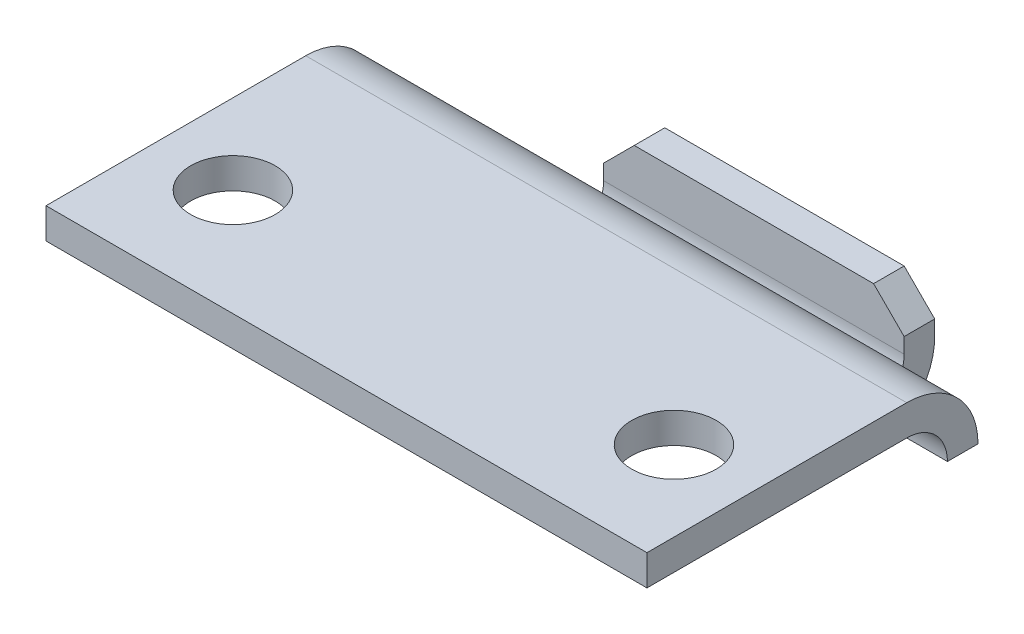
ISO-10303-21;
HEADER;
FILE_DESCRIPTION(('STEP AP214'),'2;1');
FILE_NAME('part.step','',(''),(''),'','','');
FILE_SCHEMA(('AUTOMOTIVE_DESIGN { 1 0 10303 214 1 1 1 1 }'));
ENDSEC;
DATA;
#1=APPLICATION_CONTEXT('core data for automotive mechanical design processes');
#2=APPLICATION_PROTOCOL_DEFINITION('international standard','automotive_design',2000,#1);
#3=PRODUCT_CONTEXT('',#1,'mechanical');
#4=PRODUCT('Part','Part','',(#3));
#5=PRODUCT_RELATED_PRODUCT_CATEGORY('part','',(#4));
#6=PRODUCT_DEFINITION_FORMATION('','',#4);
#7=PRODUCT_DEFINITION_CONTEXT('part definition',#1,'design');
#8=PRODUCT_DEFINITION('design','',#6,#7);
#9=PRODUCT_DEFINITION_SHAPE('','',#8);
#10=(LENGTH_UNIT() NAMED_UNIT(*) SI_UNIT(.MILLI.,.METRE.));
#11=(NAMED_UNIT(*) PLANE_ANGLE_UNIT() SI_UNIT($,.RADIAN.));
#12=(NAMED_UNIT(*) SI_UNIT($,.STERADIAN.) SOLID_ANGLE_UNIT());
#13=UNCERTAINTY_MEASURE_WITH_UNIT(LENGTH_MEASURE(1.E-05),#10,'distance_accuracy_value','');
#14=(GEOMETRIC_REPRESENTATION_CONTEXT(3) GLOBAL_UNCERTAINTY_ASSIGNED_CONTEXT((#13)) GLOBAL_UNIT_ASSIGNED_CONTEXT((#10,
#11,#12)) REPRESENTATION_CONTEXT('',''));
#15=CARTESIAN_POINT('',(0.,0.,0.));
#16=DIRECTION('',(0.,0.,1.));
#17=DIRECTION('',(1.,0.,0.));
#18=AXIS2_PLACEMENT_3D('',#15,#16,#17);
#19=CARTESIAN_POINT('',(14.9860000000004,0.,5.33400000000031));
#20=DIRECTION('',(0.,1.,0.));
#21=DIRECTION('',(0.,0.,1.00000000000001));
#22=AXIS2_PLACEMENT_3D('',#19,#20,#21);
#23=PLANE('',#22);
#24=CARTESIAN_POINT('',(10.9982000000004,0.,0.));
#25=DIRECTION('',(0.,1.,0.));
#26=DIRECTION('',(0.,0.,1.00000000000001));
#27=AXIS2_PLACEMENT_3D('',#24,#25,#26);
#28=CIRCLE('',#27,2.1082);
#29=CARTESIAN_POINT('',(10.9982000000004,0.,2.10819999999993));
#30=VERTEX_POINT('',#29);
#31=EDGE_CURVE('E302',#30,#30,#28,.T.);
#32=ORIENTED_EDGE('',*,*,#31,.T.);
#33=EDGE_LOOP('',(#32));
#34=FACE_BOUND('',#33,.T.);
#35=DIRECTION('',(0.,0.,-1.00000000000001));
#36=VECTOR('',#35,1.);
#37=CARTESIAN_POINT('',(-14.9860000000002,0.,5.33400000000039));
#38=LINE('',#37,#36);
#39=CARTESIAN_POINT('',(-14.9860000000002,0.,5.33400000000039));
#40=VERTEX_POINT('',#39);
#41=CARTESIAN_POINT('',(-14.9860000000002,0.,-7.61999999999996));
#42=VERTEX_POINT('',#41);
#43=EDGE_CURVE('E244',#40,#42,#38,.T.);
#44=ORIENTED_EDGE('',*,*,#43,.T.);
#45=DIRECTION('',(-1.00000000000001,0.,0.));
#46=VECTOR('',#45,1.);
#47=CARTESIAN_POINT('',(14.9860000000004,0.,-7.62000000000004));
#48=LINE('',#47,#46);
#49=CARTESIAN_POINT('',(14.9860000000004,0.,-7.62000000000004));
#50=VERTEX_POINT('',#49);
#51=EDGE_CURVE('E188',#50,#42,#48,.T.);
#52=ORIENTED_EDGE('',*,*,#51,.F.);
#53=DIRECTION('',(0.,0.,-1.00000000000001));
#54=VECTOR('',#53,1.);
#55=CARTESIAN_POINT('',(14.9860000000004,0.,5.33400000000031));
#56=LINE('',#55,#54);
#57=CARTESIAN_POINT('',(14.9860000000004,0.,5.33400000000031));
#58=VERTEX_POINT('',#57);
#59=EDGE_CURVE('E256',#58,#50,#56,.T.);
#60=ORIENTED_EDGE('',*,*,#59,.F.);
#61=DIRECTION('',(-1.00000000000001,0.,0.));
#62=VECTOR('',#61,1.);
#63=CARTESIAN_POINT('',(14.9860000000004,0.,5.33400000000031));
#64=LINE('',#63,#62);
#65=EDGE_CURVE('E191',#58,#40,#64,.T.);
#66=ORIENTED_EDGE('',*,*,#65,.T.);
#67=EDGE_LOOP('',(#44,#52,#60,#66));
#68=FACE_BOUND('',#67,.T.);
#69=CARTESIAN_POINT('',(-10.9982,0.,0.));
#70=DIRECTION('',(0.,1.,0.));
#71=DIRECTION('',(0.,0.,-1.00000000000001));
#72=AXIS2_PLACEMENT_3D('',#69,#70,#71);
#73=CIRCLE('',#72,2.1082);
#74=CARTESIAN_POINT('',(-10.9982,0.,-2.10820000000001));
#75=VERTEX_POINT('',#74);
#76=EDGE_CURVE('E308',#75,#75,#73,.T.);
#77=ORIENTED_EDGE('',*,*,#76,.T.);
#78=EDGE_LOOP('',(#77));
#79=FACE_BOUND('',#78,.T.);
#80=ADVANCED_FACE('F38',(#34,#68,#79),#23,.F.);
#81=CARTESIAN_POINT('',(14.9860000000004,1.524,5.33400000000031));
#82=DIRECTION('',(0.,-1.,0.));
#83=DIRECTION('',(0.,0.,-1.00000000000001));
#84=AXIS2_PLACEMENT_3D('',#81,#82,#83);
#85=PLANE('',#84);
#86=CARTESIAN_POINT('',(10.9982000000004,1.524,0.));
#87=DIRECTION('',(0.,1.,0.));
#88=DIRECTION('',(0.,0.,1.00000000000001));
#89=AXIS2_PLACEMENT_3D('',#86,#87,#88);
#90=CIRCLE('',#89,2.1082);
#91=CARTESIAN_POINT('',(10.9982000000004,1.524,2.10819999999993));
#92=VERTEX_POINT('',#91);
#93=EDGE_CURVE('E171',#92,#92,#90,.T.);
#94=ORIENTED_EDGE('',*,*,#93,.F.);
#95=EDGE_LOOP('',(#94));
#96=FACE_BOUND('',#95,.T.);
#97=DIRECTION('',(0.,0.,1.00000000000001));
#98=VECTOR('',#97,1.);
#99=CARTESIAN_POINT('',(-14.9860000000002,1.524,5.33400000000039));
#100=LINE('',#99,#98);
#101=CARTESIAN_POINT('',(-14.9860000000002,1.524,-7.61999999999996));
#102=VERTEX_POINT('',#101);
#103=CARTESIAN_POINT('',(-14.9860000000002,1.524,5.33400000000039));
#104=VERTEX_POINT('',#103);
#105=EDGE_CURVE('E251',#102,#104,#100,.T.);
#106=ORIENTED_EDGE('',*,*,#105,.T.);
#107=DIRECTION('',(-1.00000000000001,0.,0.));
#108=VECTOR('',#107,1.);
#109=CARTESIAN_POINT('',(14.9860000000004,1.524,5.33400000000031));
#110=LINE('',#109,#108);
#111=CARTESIAN_POINT('',(14.9860000000004,1.524,5.33400000000031));
#112=VERTEX_POINT('',#111);
#113=EDGE_CURVE('E265',#112,#104,#110,.T.);
#114=ORIENTED_EDGE('',*,*,#113,.F.);
#115=DIRECTION('',(0.,0.,1.00000000000001));
#116=VECTOR('',#115,1.);
#117=CARTESIAN_POINT('',(14.9860000000004,1.524,5.33400000000031));
#118=LINE('',#117,#116);
#119=CARTESIAN_POINT('',(14.9860000000004,1.524,-7.62000000000004));
#120=VERTEX_POINT('',#119);
#121=EDGE_CURVE('E263',#120,#112,#118,.T.);
#122=ORIENTED_EDGE('',*,*,#121,.F.);
#123=DIRECTION('',(-1.00000000000001,0.,0.));
#124=VECTOR('',#123,1.);
#125=CARTESIAN_POINT('',(14.9860000000004,1.524,-7.62000000000004));
#126=LINE('',#125,#124);
#127=EDGE_CURVE('E268',#120,#102,#126,.T.);
#128=ORIENTED_EDGE('',*,*,#127,.T.);
#129=EDGE_LOOP('',(#106,#114,#122,#128));
#130=FACE_BOUND('',#129,.T.);
#131=CARTESIAN_POINT('',(-10.9982,1.524,0.));
#132=DIRECTION('',(0.,1.,0.));
#133=DIRECTION('',(0.,0.,-1.00000000000001));
#134=AXIS2_PLACEMENT_3D('',#131,#132,#133);
#135=CIRCLE('',#134,2.1082);
#136=CARTESIAN_POINT('',(-10.9982,1.524,-2.10820000000001));
#137=VERTEX_POINT('',#136);
#138=EDGE_CURVE('E305',#137,#137,#135,.T.);
#139=ORIENTED_EDGE('',*,*,#138,.F.);
#140=EDGE_LOOP('',(#139));
#141=FACE_BOUND('',#140,.T.);
#142=ADVANCED_FACE('F325',(#96,#130,#141),#85,.F.);
#143=CARTESIAN_POINT('',(-14.9860000000002,-2.03200000000001,-7.62000000000002));
#144=DIRECTION('',(-1.00000000000001,0.,0.));
#145=DIRECTION('',(0.,0.,1.00000000000001));
#146=AXIS2_PLACEMENT_3D('',#143,#144,#145);
#147=PLANE('',#146);
#148=DIRECTION('',(0.,0.,-1.00000000000001));
#149=VECTOR('',#148,1.);
#150=CARTESIAN_POINT('',(-14.9860000000002,-2.03200000000001,-7.62000000000002));
#151=LINE('',#150,#149);
#152=CARTESIAN_POINT('',(-14.9860000000003,-2.03200000000001,-9.652));
#153=VERTEX_POINT('',#152);
#154=CARTESIAN_POINT('',(-14.9860000000003,-2.03200000000001,-11.176));
#155=VERTEX_POINT('',#154);
#156=EDGE_CURVE('E197',#153,#155,#151,.T.);
#157=ORIENTED_EDGE('',*,*,#156,.F.);
#158=CARTESIAN_POINT('',(-14.9860000000002,-2.03200000000001,-7.62000000000002));
#159=DIRECTION('',(-1.00000000000001,0.,0.));
#160=DIRECTION('',(0.,0.,1.00000000000001));
#161=AXIS2_PLACEMENT_3D('',#158,#159,#160);
#162=CIRCLE('',#161,2.032);
#163=EDGE_CURVE('E246',#42,#153,#162,.T.);
#164=ORIENTED_EDGE('',*,*,#163,.F.);
#165=ORIENTED_EDGE('',*,*,#43,.F.);
#166=DIRECTION('',(0.,-1.,0.));
#167=VECTOR('',#166,1.);
#168=CARTESIAN_POINT('',(-14.9860000000002,1.524,5.33400000000039));
#169=LINE('',#168,#167);
#170=EDGE_CURVE('E241',#104,#40,#169,.T.);
#171=ORIENTED_EDGE('',*,*,#170,.F.);
#172=ORIENTED_EDGE('',*,*,#105,.F.);
#173=CARTESIAN_POINT('',(-14.9860000000002,-2.03200000000001,-7.62000000000002));
#174=DIRECTION('',(1.00000000000001,0.,0.));
#175=DIRECTION('',(0.,0.,1.00000000000001));
#176=AXIS2_PLACEMENT_3D('',#173,#174,#175);
#177=CIRCLE('',#176,3.556);
#178=EDGE_CURVE('E249',#155,#102,#177,.T.);
#179=ORIENTED_EDGE('',*,*,#178,.F.);
#180=EDGE_LOOP('',(#157,#164,#165,#171,#172,#179));
#181=FACE_BOUND('',#180,.T.);
#182=ADVANCED_FACE('F330',(#181),#147,.T.);
#183=CARTESIAN_POINT('',(14.9860000000004,-2.03200000000001,-7.62000000000004));
#184=DIRECTION('',(-1.00000000000001,0.,0.));
#185=DIRECTION('',(0.,0.,1.00000000000001));
#186=AXIS2_PLACEMENT_3D('',#183,#184,#185);
#187=PLANE('',#186);
#188=CARTESIAN_POINT('',(14.9860000000004,-2.03200000000001,-7.62000000000004));
#189=DIRECTION('',(-1.00000000000001,0.,0.));
#190=DIRECTION('',(0.,0.,1.00000000000001));
#191=AXIS2_PLACEMENT_3D('',#188,#189,#190);
#192=CIRCLE('',#191,2.032);
#193=CARTESIAN_POINT('',(14.9860000000002,-2.03200000000001,-9.65200000000008));
#194=VERTEX_POINT('',#193);
#195=EDGE_CURVE('E258',#50,#194,#192,.T.);
#196=ORIENTED_EDGE('',*,*,#195,.T.);
#197=DIRECTION('',(0.,0.,-1.00000000000001));
#198=VECTOR('',#197,1.);
#199=CARTESIAN_POINT('',(14.9860000000004,-2.03200000000001,-7.62000000000004));
#200=LINE('',#199,#198);
#201=CARTESIAN_POINT('',(14.9860000000002,-2.03200000000001,-11.176));
#202=VERTEX_POINT('',#201);
#203=EDGE_CURVE('E194',#194,#202,#200,.T.);
#204=ORIENTED_EDGE('',*,*,#203,.T.);
#205=CARTESIAN_POINT('',(14.9860000000004,-2.03200000000001,-7.62000000000004));
#206=DIRECTION('',(1.00000000000001,0.,0.));
#207=DIRECTION('',(0.,0.,1.00000000000001));
#208=AXIS2_PLACEMENT_3D('',#205,#206,#207);
#209=CIRCLE('',#208,3.556);
#210=EDGE_CURVE('E261',#202,#120,#209,.T.);
#211=ORIENTED_EDGE('',*,*,#210,.T.);
#212=ORIENTED_EDGE('',*,*,#121,.T.);
#213=DIRECTION('',(0.,-1.,0.));
#214=VECTOR('',#213,1.);
#215=CARTESIAN_POINT('',(14.9860000000004,1.524,5.33400000000031));
#216=LINE('',#215,#214);
#217=EDGE_CURVE('E253',#112,#58,#216,.T.);
#218=ORIENTED_EDGE('',*,*,#217,.T.);
#219=ORIENTED_EDGE('',*,*,#59,.T.);
#220=EDGE_LOOP('',(#196,#204,#211,#212,#218,#219));
#221=FACE_BOUND('',#220,.T.);
#222=ADVANCED_FACE('F361',(#221),#187,.F.);
#223=CARTESIAN_POINT('',(14.9860000000004,1.524,5.33400000000031));
#224=DIRECTION('',(0.,0.,-1.00000000000001));
#225=DIRECTION('',(-1.00000000000001,0.,0.));
#226=AXIS2_PLACEMENT_3D('',#223,#224,#225);
#227=PLANE('',#226);
#228=ORIENTED_EDGE('',*,*,#170,.T.);
#229=ORIENTED_EDGE('',*,*,#65,.F.);
#230=ORIENTED_EDGE('',*,*,#217,.F.);
#231=ORIENTED_EDGE('',*,*,#113,.T.);
#232=EDGE_LOOP('',(#228,#229,#230,#231));
#233=FACE_BOUND('',#232,.T.);
#234=ADVANCED_FACE('F40',(#233),#227,.F.);
#235=CARTESIAN_POINT('',(14.9860000000004,-2.03200000000001,-7.62000000000004));
#236=DIRECTION('',(-1.00000000000001,0.,0.));
#237=DIRECTION('',(0.,0.,1.00000000000001));
#238=AXIS2_PLACEMENT_3D('',#235,#236,#237);
#239=CYLINDRICAL_SURFACE('',#238,2.032);
#240=ORIENTED_EDGE('',*,*,#163,.T.);
#241=DIRECTION('',(1.00000000000001,0.,0.));
#242=VECTOR('',#241,1.);
#243=CARTESIAN_POINT('',(14.9860000000002,-2.03200000000001,-9.65200000000008));
#244=LINE('',#243,#242);
#245=CARTESIAN_POINT('',(-7.49300000000017,-2.03200000000001,-9.652));
#246=VERTEX_POINT('',#245);
#247=EDGE_CURVE('E290',#153,#246,#244,.T.);
#248=ORIENTED_EDGE('',*,*,#247,.T.);
#249=DIRECTION('',(-1.00000000000001,0.,0.));
#250=VECTOR('',#249,1.);
#251=CARTESIAN_POINT('',(14.9860000000002,-2.03200000000001,-9.65200000000008));
#252=LINE('',#251,#250);
#253=CARTESIAN_POINT('',(7.49300000000028,-2.03200000000001,-9.65200000000007));
#254=VERTEX_POINT('',#253);
#255=EDGE_CURVE('E179',#254,#246,#252,.T.);
#256=ORIENTED_EDGE('',*,*,#255,.F.);
#257=EDGE_CURVE('E186',#194,#254,#252,.T.);
#258=ORIENTED_EDGE('',*,*,#257,.F.);
#259=ORIENTED_EDGE('',*,*,#195,.F.);
#260=ORIENTED_EDGE('',*,*,#51,.T.);
#261=EDGE_LOOP('',(#240,#248,#256,#258,#259,#260));
#262=FACE_BOUND('',#261,.T.);
#263=ADVANCED_FACE('F335',(#262),#239,.F.);
#264=CARTESIAN_POINT('',(14.9860000000002,-2.03200000000001,-9.65200000000008));
#265=DIRECTION('',(0.,0.,-1.00000000000001));
#266=DIRECTION('',(-1.00000000000001,0.,0.));
#267=AXIS2_PLACEMENT_3D('',#264,#265,#266);
#268=PLANE('',#267);
#269=ORIENTED_EDGE('',*,*,#255,.T.);
#270=DIRECTION('',(0.,-1.,0.));
#271=VECTOR('',#270,1.);
#272=CARTESIAN_POINT('',(-7.49300000000017,-2.03200000000001,-9.652));
#273=LINE('',#272,#271);
#274=CARTESIAN_POINT('',(-7.49300000000017,-3.81000000000001,-9.652));
#275=VERTEX_POINT('',#274);
#276=EDGE_CURVE('E161',#246,#275,#273,.T.);
#277=ORIENTED_EDGE('',*,*,#276,.T.);
#278=DIRECTION('',(-1.00000000000001,0.,0.));
#279=VECTOR('',#278,1.);
#280=CARTESIAN_POINT('',(14.9860000000002,-3.81000000000001,-9.65200000000008));
#281=LINE('',#280,#279);
#282=CARTESIAN_POINT('',(7.49300000000028,-3.81000000000001,-9.65200000000008));
#283=VERTEX_POINT('',#282);
#284=EDGE_CURVE('E158',#283,#275,#281,.T.);
#285=ORIENTED_EDGE('',*,*,#284,.F.);
#286=DIRECTION('',(0.,1.,0.));
#287=VECTOR('',#286,1.);
#288=CARTESIAN_POINT('',(7.49300000000028,-2.03200000000001,-9.65200000000007));
#289=LINE('',#288,#287);
#290=EDGE_CURVE('E238',#283,#254,#289,.T.);
#291=ORIENTED_EDGE('',*,*,#290,.T.);
#292=EDGE_LOOP('',(#269,#277,#285,#291));
#293=FACE_BOUND('',#292,.T.);
#294=ADVANCED_FACE('F338',(#293),#268,.F.);
#295=CARTESIAN_POINT('',(14.9860000000002,-3.81000000000001,-13.0810000000001));
#296=DIRECTION('',(-1.00000000000001,0.,0.));
#297=DIRECTION('',(0.,0.,1.00000000000001));
#298=AXIS2_PLACEMENT_3D('',#295,#296,#297);
#299=CYLINDRICAL_SURFACE('',#298,3.429);
#300=ORIENTED_EDGE('',*,*,#284,.T.);
#301=CARTESIAN_POINT('',(-7.49300000000017,-3.81000000000001,-13.081));
#302=DIRECTION('',(1.00000000000001,0.,0.));
#303=DIRECTION('',(0.,1.,0.));
#304=AXIS2_PLACEMENT_3D('',#301,#302,#303);
#305=CIRCLE('',#304,3.429);
#306=CARTESIAN_POINT('',(-7.49300000000017,-3.81000000000001,-16.51));
#307=VERTEX_POINT('',#306);
#308=EDGE_CURVE('E152',#275,#307,#305,.T.);
#309=ORIENTED_EDGE('',*,*,#308,.T.);
#310=DIRECTION('',(-1.00000000000001,0.,0.));
#311=VECTOR('',#310,1.);
#312=CARTESIAN_POINT('',(14.9860000000002,-3.81000000000001,-16.5100000000001));
#313=LINE('',#312,#311);
#314=CARTESIAN_POINT('',(7.49300000000028,-3.81000000000001,-16.5100000000001));
#315=VERTEX_POINT('',#314);
#316=EDGE_CURVE('E156',#315,#307,#313,.T.);
#317=ORIENTED_EDGE('',*,*,#316,.F.);
#318=CARTESIAN_POINT('',(7.49300000000028,-3.81000000000001,-13.0810000000001));
#319=DIRECTION('',(-1.00000000000001,0.,0.));
#320=DIRECTION('',(0.,-1.,0.));
#321=AXIS2_PLACEMENT_3D('',#318,#319,#320);
#322=CIRCLE('',#321,3.429);
#323=EDGE_CURVE('E224',#315,#283,#322,.T.);
#324=ORIENTED_EDGE('',*,*,#323,.T.);
#325=EDGE_LOOP('',(#300,#309,#317,#324));
#326=FACE_BOUND('',#325,.T.);
#327=ADVANCED_FACE('F154',(#326),#299,.T.);
#328=CARTESIAN_POINT('',(14.9860000000002,-3.81000000000001,-16.5100000000001));
#329=DIRECTION('',(0.,0.,1.00000000000001));
#330=DIRECTION('',(0.,-1.,0.));
#331=AXIS2_PLACEMENT_3D('',#328,#329,#330);
#332=PLANE('',#331);
#333=DIRECTION('',(-1.00000000000001,0.,0.));
#334=VECTOR('',#333,1.);
#335=CARTESIAN_POINT('',(14.9860000000002,-1.524,-16.5100000000001));
#336=LINE('',#335,#334);
#337=CARTESIAN_POINT('',(5.96900000000025,-1.524,-16.5100000000001));
#338=VERTEX_POINT('',#337);
#339=CARTESIAN_POINT('',(-5.96900000000014,-1.524,-16.51));
#340=VERTEX_POINT('',#339);
#341=EDGE_CURVE('E177',#338,#340,#336,.T.);
#342=ORIENTED_EDGE('',*,*,#341,.F.);
#343=DIRECTION('',(-0.707106781186553,0.707106781186549,0.));
#344=VECTOR('',#343,1.);
#345=CARTESIAN_POINT('',(5.96900000000025,-1.524,-16.5100000000001));
#346=LINE('',#345,#344);
#347=CARTESIAN_POINT('',(7.49300000000028,-3.048,-16.5100000000001));
#348=VERTEX_POINT('',#347);
#349=EDGE_CURVE('E207',#338,#348,#346,.F.);
#350=ORIENTED_EDGE('',*,*,#349,.T.);
#351=DIRECTION('',(0.,-1.,0.));
#352=VECTOR('',#351,1.);
#353=CARTESIAN_POINT('',(7.49300000000028,-2.03200000000001,-16.5100000000001));
#354=LINE('',#353,#352);
#355=EDGE_CURVE('E175',#348,#315,#354,.T.);
#356=ORIENTED_EDGE('',*,*,#355,.T.);
#357=ORIENTED_EDGE('',*,*,#316,.T.);
#358=DIRECTION('',(0.,1.,0.));
#359=VECTOR('',#358,1.);
#360=CARTESIAN_POINT('',(-7.49300000000017,-2.03200000000001,-16.51));
#361=LINE('',#360,#359);
#362=CARTESIAN_POINT('',(-7.49300000000017,-3.048,-16.51));
#363=VERTEX_POINT('',#362);
#364=EDGE_CURVE('E165',#307,#363,#361,.T.);
#365=ORIENTED_EDGE('',*,*,#364,.T.);
#366=DIRECTION('',(-0.707106781186553,-0.707106781186548,0.));
#367=VECTOR('',#366,1.);
#368=CARTESIAN_POINT('',(-5.96900000000014,-1.524,-16.51));
#369=LINE('',#368,#367);
#370=EDGE_CURVE('E205',#363,#340,#369,.F.);
#371=ORIENTED_EDGE('',*,*,#370,.T.);
#372=EDGE_LOOP('',(#342,#350,#356,#357,#365,#371));
#373=FACE_BOUND('',#372,.T.);
#374=ADVANCED_FACE('F174',(#373),#332,.F.);
#375=CARTESIAN_POINT('',(14.9860000000002,-1.524,-14.986));
#376=DIRECTION('',(0.,-1.,0.));
#377=DIRECTION('',(0.,0.,-1.00000000000001));
#378=AXIS2_PLACEMENT_3D('',#375,#376,#377);
#379=PLANE('',#378);
#380=DIRECTION('',(-1.00000000000001,0.,0.));
#381=VECTOR('',#380,1.);
#382=CARTESIAN_POINT('',(14.9860000000002,-1.524,-14.986));
#383=LINE('',#382,#381);
#384=CARTESIAN_POINT('',(5.96900000000025,-1.524,-14.986));
#385=VERTEX_POINT('',#384);
#386=CARTESIAN_POINT('',(-5.96900000000014,-1.524,-14.986));
#387=VERTEX_POINT('',#386);
#388=EDGE_CURVE('E182',#385,#387,#383,.T.);
#389=ORIENTED_EDGE('',*,*,#388,.F.);
#390=DIRECTION('',(0.,0.,-1.00000000000001));
#391=VECTOR('',#390,1.);
#392=CARTESIAN_POINT('',(5.96900000000025,-1.524,-14.986));
#393=LINE('',#392,#391);
#394=EDGE_CURVE('E202',#385,#338,#393,.T.);
#395=ORIENTED_EDGE('',*,*,#394,.T.);
#396=ORIENTED_EDGE('',*,*,#341,.T.);
#397=DIRECTION('',(0.,0.,1.00000000000001));
#398=VECTOR('',#397,1.);
#399=CARTESIAN_POINT('',(-5.96900000000014,-1.524,-14.986));
#400=LINE('',#399,#398);
#401=EDGE_CURVE('E199',#340,#387,#400,.T.);
#402=ORIENTED_EDGE('',*,*,#401,.T.);
#403=EDGE_LOOP('',(#389,#395,#396,#402));
#404=FACE_BOUND('',#403,.T.);
#405=ADVANCED_FACE('F218',(#404),#379,.F.);
#406=CARTESIAN_POINT('',(14.9860000000002,-3.81000000000001,-14.986));
#407=DIRECTION('',(0.,0.,-1.00000000000001));
#408=DIRECTION('',(0.,1.,0.));
#409=AXIS2_PLACEMENT_3D('',#406,#407,#408);
#410=PLANE('',#409);
#411=DIRECTION('',(0.,1.,0.));
#412=VECTOR('',#411,1.);
#413=CARTESIAN_POINT('',(7.49300000000028,-3.81000000000001,-14.986));
#414=LINE('',#413,#412);
#415=CARTESIAN_POINT('',(7.49300000000028,-3.81000000000001,-14.986));
#416=VERTEX_POINT('',#415);
#417=CARTESIAN_POINT('',(7.49300000000028,-3.048,-14.986));
#418=VERTEX_POINT('',#417);
#419=EDGE_CURVE('E214',#416,#418,#414,.T.);
#420=ORIENTED_EDGE('',*,*,#419,.T.);
#421=DIRECTION('',(0.707106781186553,-0.707106781186549,0.));
#422=VECTOR('',#421,1.);
#423=CARTESIAN_POINT('',(5.96900000000025,-1.524,-14.986));
#424=LINE('',#423,#422);
#425=EDGE_CURVE('E46',#418,#385,#424,.F.);
#426=ORIENTED_EDGE('',*,*,#425,.T.);
#427=ORIENTED_EDGE('',*,*,#388,.T.);
#428=DIRECTION('',(0.707106781186553,0.707106781186548,0.));
#429=VECTOR('',#428,1.);
#430=CARTESIAN_POINT('',(-5.96900000000014,-1.524,-14.986));
#431=LINE('',#430,#429);
#432=CARTESIAN_POINT('',(-7.49300000000017,-3.048,-14.986));
#433=VERTEX_POINT('',#432);
#434=EDGE_CURVE('E53',#387,#433,#431,.F.);
#435=ORIENTED_EDGE('',*,*,#434,.T.);
#436=DIRECTION('',(0.,-1.,0.));
#437=VECTOR('',#436,1.);
#438=CARTESIAN_POINT('',(-7.49300000000017,-3.81000000000001,-14.986));
#439=LINE('',#438,#437);
#440=CARTESIAN_POINT('',(-7.49300000000017,-3.81000000000001,-14.986));
#441=VERTEX_POINT('',#440);
#442=EDGE_CURVE('E162',#433,#441,#439,.T.);
#443=ORIENTED_EDGE('',*,*,#442,.T.);
#444=DIRECTION('',(-1.00000000000001,0.,0.));
#445=VECTOR('',#444,1.);
#446=CARTESIAN_POINT('',(14.9860000000002,-3.81000000000001,-14.986));
#447=LINE('',#446,#445);
#448=EDGE_CURVE('E220',#416,#441,#447,.T.);
#449=ORIENTED_EDGE('',*,*,#448,.F.);
#450=EDGE_LOOP('',(#420,#426,#427,#435,#443,#449));
#451=FACE_BOUND('',#450,.T.);
#452=ADVANCED_FACE('F212',(#451),#410,.F.);
#453=CARTESIAN_POINT('',(14.9860000000002,-3.81000000000001,-13.0810000000001));
#454=DIRECTION('',(-1.00000000000001,0.,0.));
#455=DIRECTION('',(0.,0.,1.00000000000001));
#456=AXIS2_PLACEMENT_3D('',#453,#454,#455);
#457=CYLINDRICAL_SURFACE('',#456,1.905);
#458=ORIENTED_EDGE('',*,*,#448,.T.);
#459=CARTESIAN_POINT('',(-7.49300000000017,-3.81000000000001,-13.081));
#460=DIRECTION('',(1.00000000000001,0.,0.));
#461=DIRECTION('',(0.,1.,0.));
#462=AXIS2_PLACEMENT_3D('',#459,#460,#461);
#463=CIRCLE('',#462,1.905);
#464=CARTESIAN_POINT('',(-7.49300000000017,-3.81000000000001,-11.176));
#465=VERTEX_POINT('',#464);
#466=EDGE_CURVE('E283',#441,#465,#463,.F.);
#467=ORIENTED_EDGE('',*,*,#466,.T.);
#468=DIRECTION('',(-1.00000000000001,0.,0.));
#469=VECTOR('',#468,1.);
#470=CARTESIAN_POINT('',(14.9860000000002,-3.81000000000001,-11.176));
#471=LINE('',#470,#469);
#472=CARTESIAN_POINT('',(7.49300000000028,-3.81000000000001,-11.176));
#473=VERTEX_POINT('',#472);
#474=EDGE_CURVE('E275',#473,#465,#471,.T.);
#475=ORIENTED_EDGE('',*,*,#474,.F.);
#476=CARTESIAN_POINT('',(7.49300000000028,-3.81000000000001,-13.0810000000001));
#477=DIRECTION('',(-1.00000000000001,0.,0.));
#478=DIRECTION('',(0.,-1.,0.));
#479=AXIS2_PLACEMENT_3D('',#476,#477,#478);
#480=CIRCLE('',#479,1.905);
#481=EDGE_CURVE('E234',#473,#416,#480,.F.);
#482=ORIENTED_EDGE('',*,*,#481,.T.);
#483=EDGE_LOOP('',(#458,#467,#475,#482));
#484=FACE_BOUND('',#483,.T.);
#485=ADVANCED_FACE('F280',(#484),#457,.F.);
#486=CARTESIAN_POINT('',(14.9860000000002,-2.03200000000001,-11.176));
#487=DIRECTION('',(0.,0.,1.00000000000001));
#488=DIRECTION('',(1.00000000000001,0.,0.));
#489=AXIS2_PLACEMENT_3D('',#486,#487,#488);
#490=PLANE('',#489);
#491=ORIENTED_EDGE('',*,*,#474,.T.);
#492=DIRECTION('',(0.,1.,0.));
#493=VECTOR('',#492,1.);
#494=CARTESIAN_POINT('',(-7.49300000000017,-2.03200000000001,-11.176));
#495=LINE('',#494,#493);
#496=CARTESIAN_POINT('',(-7.49300000000017,-2.03200000000001,-11.176));
#497=VERTEX_POINT('',#496);
#498=EDGE_CURVE('E288',#465,#497,#495,.T.);
#499=ORIENTED_EDGE('',*,*,#498,.T.);
#500=DIRECTION('',(-1.00000000000001,0.,0.));
#501=VECTOR('',#500,1.);
#502=CARTESIAN_POINT('',(14.9860000000002,-2.03200000000001,-11.176));
#503=LINE('',#502,#501);
#504=CARTESIAN_POINT('',(7.49300000000028,-2.03200000000001,-11.176));
#505=VERTEX_POINT('',#504);
#506=EDGE_CURVE('E271',#505,#497,#503,.T.);
#507=ORIENTED_EDGE('',*,*,#506,.F.);
#508=DIRECTION('',(0.,-1.,0.));
#509=VECTOR('',#508,1.);
#510=CARTESIAN_POINT('',(7.49300000000028,-2.03200000000001,-11.176));
#511=LINE('',#510,#509);
#512=EDGE_CURVE('E228',#505,#473,#511,.T.);
#513=ORIENTED_EDGE('',*,*,#512,.T.);
#514=EDGE_LOOP('',(#491,#499,#507,#513));
#515=FACE_BOUND('',#514,.T.);
#516=ADVANCED_FACE('F353',(#515),#490,.F.);
#517=CARTESIAN_POINT('',(14.9860000000004,-2.03200000000001,-7.62000000000004));
#518=DIRECTION('',(-1.00000000000001,0.,0.));
#519=DIRECTION('',(0.,0.,1.00000000000001));
#520=AXIS2_PLACEMENT_3D('',#517,#518,#519);
#521=CYLINDRICAL_SURFACE('',#520,3.556);
#522=ORIENTED_EDGE('',*,*,#178,.T.);
#523=ORIENTED_EDGE('',*,*,#127,.F.);
#524=ORIENTED_EDGE('',*,*,#210,.F.);
#525=EDGE_CURVE('E272',#202,#505,#503,.T.);
#526=ORIENTED_EDGE('',*,*,#525,.T.);
#527=ORIENTED_EDGE('',*,*,#506,.T.);
#528=DIRECTION('',(-1.00000000000001,0.,0.));
#529=VECTOR('',#528,1.);
#530=CARTESIAN_POINT('',(14.9860000000002,-2.03200000000001,-11.176));
#531=LINE('',#530,#529);
#532=EDGE_CURVE('E295',#497,#155,#531,.T.);
#533=ORIENTED_EDGE('',*,*,#532,.T.);
#534=EDGE_LOOP('',(#522,#523,#524,#526,#527,#533));
#535=FACE_BOUND('',#534,.T.);
#536=ADVANCED_FACE('F356',(#535),#521,.T.);
#537=CARTESIAN_POINT('',(7.49300000000028,-2.03200000000001,-16.5100000000001));
#538=DIRECTION('',(-1.00000000000001,0.,0.));
#539=DIRECTION('',(0.,-1.,0.));
#540=AXIS2_PLACEMENT_3D('',#537,#538,#539);
#541=PLANE('',#540);
#542=ORIENTED_EDGE('',*,*,#355,.F.);
#543=DIRECTION('',(0.,0.,1.00000000000001));
#544=VECTOR('',#543,1.);
#545=CARTESIAN_POINT('',(7.49300000000028,-3.048,-16.5100000000001));
#546=LINE('',#545,#544);
#547=EDGE_CURVE('E61',#348,#418,#546,.T.);
#548=ORIENTED_EDGE('',*,*,#547,.T.);
#549=ORIENTED_EDGE('',*,*,#419,.F.);
#550=ORIENTED_EDGE('',*,*,#481,.F.);
#551=ORIENTED_EDGE('',*,*,#512,.F.);
#552=DIRECTION('',(0.,0.,1.00000000000001));
#553=VECTOR('',#552,1.);
#554=CARTESIAN_POINT('',(7.49300000000028,-2.03200000000001,-16.5100000000001));
#555=LINE('',#554,#553);
#556=EDGE_CURVE('E225',#505,#254,#555,.T.);
#557=ORIENTED_EDGE('',*,*,#556,.T.);
#558=ORIENTED_EDGE('',*,*,#290,.F.);
#559=ORIENTED_EDGE('',*,*,#323,.F.);
#560=EDGE_LOOP('',(#542,#548,#549,#550,#551,#557,#558,#559));
#561=FACE_BOUND('',#560,.T.);
#562=ADVANCED_FACE('F222',(#561),#541,.F.);
#563=CARTESIAN_POINT('',(7.49300000000028,-2.03200000000001,-16.5100000000001));
#564=DIRECTION('',(0.,1.,0.));
#565=DIRECTION('',(0.,0.,1.00000000000001));
#566=AXIS2_PLACEMENT_3D('',#563,#564,#565);
#567=PLANE('',#566);
#568=ORIENTED_EDGE('',*,*,#556,.F.);
#569=ORIENTED_EDGE('',*,*,#525,.F.);
#570=ORIENTED_EDGE('',*,*,#203,.F.);
#571=ORIENTED_EDGE('',*,*,#257,.T.);
#572=EDGE_LOOP('',(#568,#569,#570,#571));
#573=FACE_BOUND('',#572,.T.);
#574=ADVANCED_FACE('F370',(#573),#567,.F.);
#575=CARTESIAN_POINT('',(-7.49300000000017,-2.03200000000001,-16.51));
#576=DIRECTION('',(1.00000000000001,0.,0.));
#577=DIRECTION('',(0.,1.,0.));
#578=AXIS2_PLACEMENT_3D('',#575,#576,#577);
#579=PLANE('',#578);
#580=ORIENTED_EDGE('',*,*,#442,.F.);
#581=DIRECTION('',(0.,0.,-1.00000000000001));
#582=VECTOR('',#581,1.);
#583=CARTESIAN_POINT('',(-7.49300000000017,-3.048,-16.51));
#584=LINE('',#583,#582);
#585=EDGE_CURVE('E11',#433,#363,#584,.T.);
#586=ORIENTED_EDGE('',*,*,#585,.T.);
#587=ORIENTED_EDGE('',*,*,#364,.F.);
#588=ORIENTED_EDGE('',*,*,#308,.F.);
#589=ORIENTED_EDGE('',*,*,#276,.F.);
#590=DIRECTION('',(0.,0.,1.00000000000001));
#591=VECTOR('',#590,1.);
#592=CARTESIAN_POINT('',(-7.49300000000017,-2.03200000000001,-16.51));
#593=LINE('',#592,#591);
#594=EDGE_CURVE('E170',#497,#246,#593,.T.);
#595=ORIENTED_EDGE('',*,*,#594,.F.);
#596=ORIENTED_EDGE('',*,*,#498,.F.);
#597=ORIENTED_EDGE('',*,*,#466,.F.);
#598=EDGE_LOOP('',(#580,#586,#587,#588,#589,#595,#596,#597));
#599=FACE_BOUND('',#598,.T.);
#600=ADVANCED_FACE('F166',(#599),#579,.F.);
#601=CARTESIAN_POINT('',(-7.49300000000017,-2.03200000000001,-16.51));
#602=DIRECTION('',(0.,1.,0.));
#603=DIRECTION('',(0.,0.,1.00000000000001));
#604=AXIS2_PLACEMENT_3D('',#601,#602,#603);
#605=PLANE('',#604);
#606=ORIENTED_EDGE('',*,*,#156,.T.);
#607=ORIENTED_EDGE('',*,*,#532,.F.);
#608=ORIENTED_EDGE('',*,*,#594,.T.);
#609=ORIENTED_EDGE('',*,*,#247,.F.);
#610=EDGE_LOOP('',(#606,#607,#608,#609));
#611=FACE_BOUND('',#610,.T.);
#612=ADVANCED_FACE('F374',(#611),#605,.F.);
#613=CARTESIAN_POINT('',(5.96900000000025,-1.524,-14.986));
#614=DIRECTION('',(-0.707106781186555,-0.707106781186546,0.));
#615=DIRECTION('',(0.707106781186553,-0.707106781186549,0.));
#616=AXIS2_PLACEMENT_3D('',#613,#614,#615);
#617=PLANE('',#616);
#618=ORIENTED_EDGE('',*,*,#425,.F.);
#619=ORIENTED_EDGE('',*,*,#547,.F.);
#620=ORIENTED_EDGE('',*,*,#349,.F.);
#621=ORIENTED_EDGE('',*,*,#394,.F.);
#622=EDGE_LOOP('',(#618,#619,#620,#621));
#623=FACE_BOUND('',#622,.T.);
#624=ADVANCED_FACE('F221',(#623),#617,.F.);
#625=CARTESIAN_POINT('',(-5.96900000000014,-1.524,-14.986));
#626=DIRECTION('',(0.707106781186555,-0.707106781186547,0.));
#627=DIRECTION('',(0.707106781186553,0.707106781186548,0.));
#628=AXIS2_PLACEMENT_3D('',#625,#626,#627);
#629=PLANE('',#628);
#630=ORIENTED_EDGE('',*,*,#370,.F.);
#631=ORIENTED_EDGE('',*,*,#585,.F.);
#632=ORIENTED_EDGE('',*,*,#434,.F.);
#633=ORIENTED_EDGE('',*,*,#401,.F.);
#634=EDGE_LOOP('',(#630,#631,#632,#633));
#635=FACE_BOUND('',#634,.T.);
#636=ADVANCED_FACE('F321',(#635),#629,.F.);
#637=CARTESIAN_POINT('',(10.9982000000004,1.524,0.));
#638=DIRECTION('',(0.,-1.,0.));
#639=DIRECTION('',(0.,0.,-1.00000000000001));
#640=AXIS2_PLACEMENT_3D('',#637,#638,#639);
#641=CYLINDRICAL_SURFACE('',#640,2.1082);
#642=ORIENTED_EDGE('',*,*,#93,.T.);
#643=EDGE_LOOP('',(#642));
#644=FACE_BOUND('',#643,.T.);
#645=ORIENTED_EDGE('',*,*,#31,.F.);
#646=EDGE_LOOP('',(#645));
#647=FACE_BOUND('',#646,.T.);
#648=ADVANCED_FACE('F315',(#644,#647),#641,.F.);
#649=CARTESIAN_POINT('',(-10.9982,1.524,0.));
#650=DIRECTION('',(0.,-1.,0.));
#651=DIRECTION('',(0.,0.,-1.00000000000001));
#652=AXIS2_PLACEMENT_3D('',#649,#650,#651);
#653=CYLINDRICAL_SURFACE('',#652,2.1082);
#654=ORIENTED_EDGE('',*,*,#138,.T.);
#655=EDGE_LOOP('',(#654));
#656=FACE_BOUND('',#655,.T.);
#657=ORIENTED_EDGE('',*,*,#76,.F.);
#658=EDGE_LOOP('',(#657));
#659=FACE_BOUND('',#658,.T.);
#660=ADVANCED_FACE('F313',(#656,#659),#653,.F.);
#661=CLOSED_SHELL('',(#80,#142,#182,#222,#234,#263,#294,#327,#374,#405,#452,#485,#516,#536,#562,
#574,#600,#612,#624,#636,#648,#660));
#662=MANIFOLD_SOLID_BREP('B2',#661);
#663=ADVANCED_BREP_SHAPE_REPRESENTATION('',(#18,#662),#14);
#664=SHAPE_DEFINITION_REPRESENTATION(#9,#663);
ENDSEC;
END-ISO-10303-21;
